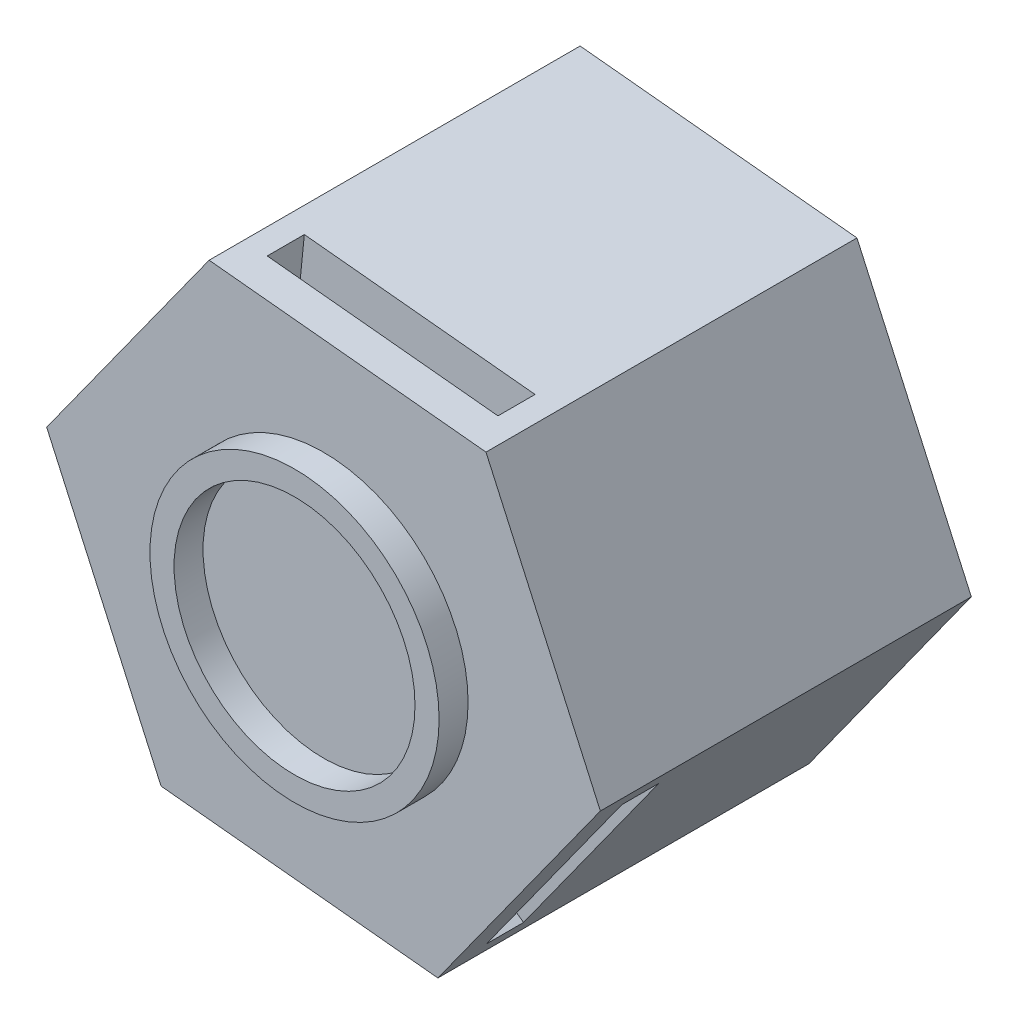
ISO-10303-21;
HEADER;
FILE_DESCRIPTION(('STEP AP214'),'2;1');
FILE_NAME('part.step','',(''),(''),'','','');
FILE_SCHEMA(('AUTOMOTIVE_DESIGN { 1 0 10303 214 1 1 1 1 }'));
ENDSEC;
DATA;
#1=APPLICATION_CONTEXT('core data for automotive mechanical design processes');
#2=APPLICATION_PROTOCOL_DEFINITION('international standard','automotive_design',2000,#1);
#3=PRODUCT_CONTEXT('',#1,'mechanical');
#4=PRODUCT('Part','Part','',(#3));
#5=PRODUCT_RELATED_PRODUCT_CATEGORY('part','',(#4));
#6=PRODUCT_DEFINITION_FORMATION('','',#4);
#7=PRODUCT_DEFINITION_CONTEXT('part definition',#1,'design');
#8=PRODUCT_DEFINITION('design','',#6,#7);
#9=PRODUCT_DEFINITION_SHAPE('','',#8);
#10=(LENGTH_UNIT() NAMED_UNIT(*) SI_UNIT(.MILLI.,.METRE.));
#11=(NAMED_UNIT(*) PLANE_ANGLE_UNIT() SI_UNIT($,.RADIAN.));
#12=(NAMED_UNIT(*) SI_UNIT($,.STERADIAN.) SOLID_ANGLE_UNIT());
#13=UNCERTAINTY_MEASURE_WITH_UNIT(LENGTH_MEASURE(1.E-05),#10,'distance_accuracy_value','');
#14=(GEOMETRIC_REPRESENTATION_CONTEXT(3) GLOBAL_UNCERTAINTY_ASSIGNED_CONTEXT((#13)) GLOBAL_UNIT_ASSIGNED_CONTEXT((#10,
#11,#12)) REPRESENTATION_CONTEXT('',''));
#15=CARTESIAN_POINT('',(0.,0.,0.));
#16=DIRECTION('',(0.,0.,1.));
#17=DIRECTION('',(1.,0.,0.));
#18=AXIS2_PLACEMENT_3D('',#15,#16,#17);
#19=CARTESIAN_POINT('',(-18.9475747095238,-8.54338414371113,2.));
#20=DIRECTION('',(0.911615613252842,0.4110437612635,0.));
#21=DIRECTION('',(-0.4110437612635,0.911615613252842,0.));
#22=AXIS2_PLACEMENT_3D('',#19,#20,#21);
#23=PLANE('',#22);
#24=DIRECTION('',(0.,0.,1.));
#25=VECTOR('',#24,1.);
#26=CARTESIAN_POINT('',(-14.8371370968889,-17.6595402762395,-1.02208910930593));
#27=LINE('',#26,#25);
#28=CARTESIAN_POINT('',(-14.8371370968888,-17.6595402762395,-4.22208910930593));
#29=VERTEX_POINT('',#28);
#30=CARTESIAN_POINT('',(-14.8371370968889,-17.6595402762395,-1.02208910930593));
#31=VERTEX_POINT('',#30);
#32=EDGE_CURVE('E201',#29,#31,#27,.T.);
#33=ORIENTED_EDGE('',*,*,#32,.F.);
#34=DIRECTION('',(0.411043761263495,-0.911615613252844,0.));
#35=VECTOR('',#34,1.);
#36=CARTESIAN_POINT('',(-14.8371370968889,-17.6595402762395,-4.22208910930593));
#37=LINE('',#36,#35);
#38=CARTESIAN_POINT('',(-23.0580123221588,0.57277198881742,-4.22208910930594));
#39=VERTEX_POINT('',#38);
#40=EDGE_CURVE('E59',#39,#29,#37,.T.);
#41=ORIENTED_EDGE('',*,*,#40,.F.);
#42=DIRECTION('',(0.,0.,-1.));
#43=VECTOR('',#42,1.);
#44=CARTESIAN_POINT('',(-23.0580123221588,0.57277198881742,-1.02208910930594));
#45=LINE('',#44,#43);
#46=CARTESIAN_POINT('',(-23.0580123221588,0.57277198881742,-1.02208910930594));
#47=VERTEX_POINT('',#46);
#48=EDGE_CURVE('E189',#47,#39,#45,.T.);
#49=ORIENTED_EDGE('',*,*,#48,.F.);
#50=DIRECTION('',(-0.411043761263495,0.911615613252844,0.));
#51=VECTOR('',#50,1.);
#52=CARTESIAN_POINT('',(-14.8371370968889,-17.6595402762395,-1.02208910930593));
#53=LINE('',#52,#51);
#54=EDGE_CURVE('E192',#31,#47,#53,.T.);
#55=ORIENTED_EDGE('',*,*,#54,.F.);
#56=EDGE_LOOP('',(#33,#41,#49,#55));
#57=FACE_BOUND('',#56,.T.);
#58=DIRECTION('',(0.,0.,-1.));
#59=VECTOR('',#58,1.);
#60=CARTESIAN_POINT('',(-23.8800998446858,2.39600321532298,2.));
#61=LINE('',#60,#59);
#62=CARTESIAN_POINT('',(-23.8800998446858,2.39600321532298,2.));
#63=VERTEX_POINT('',#62);
#64=CARTESIAN_POINT('',(-23.8800998446858,2.39600321532298,-30.));
#65=VERTEX_POINT('',#64);
#66=EDGE_CURVE('E312',#63,#65,#61,.T.);
#67=ORIENTED_EDGE('',*,*,#66,.T.);
#68=DIRECTION('',(0.4110437612635,-0.911615613252842,0.));
#69=VECTOR('',#68,1.);
#70=CARTESIAN_POINT('',(-18.9475747095238,-8.54338414371113,-30.));
#71=LINE('',#70,#69);
#72=CARTESIAN_POINT('',(-14.0150495743618,-19.4827715027452,-30.));
#73=VERTEX_POINT('',#72);
#74=EDGE_CURVE('E278',#65,#73,#71,.T.);
#75=ORIENTED_EDGE('',*,*,#74,.T.);
#76=DIRECTION('',(0.,0.,-1.));
#77=VECTOR('',#76,1.);
#78=CARTESIAN_POINT('',(-14.0150495743618,-19.4827715027452,2.));
#79=LINE('',#78,#77);
#80=CARTESIAN_POINT('',(-14.0150495743618,-19.4827715027452,2.));
#81=VERTEX_POINT('',#80);
#82=EDGE_CURVE('E52',#81,#73,#79,.T.);
#83=ORIENTED_EDGE('',*,*,#82,.F.);
#84=DIRECTION('',(0.4110437612635,-0.911615613252842,0.));
#85=VECTOR('',#84,1.);
#86=CARTESIAN_POINT('',(-18.9475747095238,-8.54338414371113,2.));
#87=LINE('',#86,#85);
#88=EDGE_CURVE('E299',#63,#81,#87,.T.);
#89=ORIENTED_EDGE('',*,*,#88,.F.);
#90=EDGE_LOOP('',(#67,#75,#83,#89));
#91=FACE_BOUND('',#90,.T.);
#92=ADVANCED_FACE('F45',(#57,#91),#23,.F.);
#93=CARTESIAN_POINT('',(-2.07499965201891,-20.6807731104067,2.));
#94=DIRECTION('',(0.0998334673051246,0.995004160195241,0.));
#95=DIRECTION('',(-0.995004160195241,0.0998334673051247,0.));
#96=AXIS2_PLACEMENT_3D('',#93,#94,#95);
#97=PLANE('',#96);
#98=ORIENTED_EDGE('',*,*,#82,.T.);
#99=DIRECTION('',(0.995004160195241,-0.0998334673051247,0.));
#100=VECTOR('',#99,1.);
#101=CARTESIAN_POINT('',(-2.07499965201891,-20.6807731104067,-30.));
#102=LINE('',#101,#100);
#103=CARTESIAN_POINT('',(9.86505027032396,-21.8787747180682,-30.));
#104=VERTEX_POINT('',#103);
#105=EDGE_CURVE('E281',#73,#104,#102,.T.);
#106=ORIENTED_EDGE('',*,*,#105,.T.);
#107=DIRECTION('',(0.,0.,-1.));
#108=VECTOR('',#107,1.);
#109=CARTESIAN_POINT('',(9.86505027032396,-21.8787747180682,2.));
#110=LINE('',#109,#108);
#111=CARTESIAN_POINT('',(9.86505027032396,-21.8787747180682,2.));
#112=VERTEX_POINT('',#111);
#113=EDGE_CURVE('E320',#112,#104,#110,.T.);
#114=ORIENTED_EDGE('',*,*,#113,.F.);
#115=DIRECTION('',(0.995004160195241,-0.0998334673051247,0.));
#116=VECTOR('',#115,1.);
#117=CARTESIAN_POINT('',(-2.07499965201891,-20.6807731104067,2.));
#118=LINE('',#117,#116);
#119=EDGE_CURVE('E302',#81,#112,#118,.T.);
#120=ORIENTED_EDGE('',*,*,#119,.F.);
#121=EDGE_LOOP('',(#98,#106,#114,#120));
#122=FACE_BOUND('',#121,.T.);
#123=ADVANCED_FACE('F324',(#122),#97,.F.);
#124=CARTESIAN_POINT('',(16.8725750575049,-12.1373889666956,2.));
#125=DIRECTION('',(-0.811782145947718,0.583960398931741,0.));
#126=DIRECTION('',(-0.583960398931741,-0.811782145947718,0.));
#127=AXIS2_PLACEMENT_3D('',#124,#125,#126);
#128=PLANE('',#127);
#129=DIRECTION('',(0.,0.,1.));
#130=VECTOR('',#129,1.);
#131=CARTESIAN_POINT('',(22.7121790468223,-4.01956750721841,-1.02208910930593));
#132=LINE('',#131,#130);
#133=CARTESIAN_POINT('',(22.7121790468223,-4.01956750721841,-4.22208910930593));
#134=VERTEX_POINT('',#133);
#135=CARTESIAN_POINT('',(22.7121790468223,-4.01956750721841,-1.02208910930593));
#136=VERTEX_POINT('',#135);
#137=EDGE_CURVE('E256',#134,#136,#132,.T.);
#138=ORIENTED_EDGE('',*,*,#137,.F.);
#139=DIRECTION('',(0.583960398931741,0.811782145947718,0.));
#140=VECTOR('',#139,1.);
#141=CARTESIAN_POINT('',(22.7121790468223,-4.01956750721841,-4.22208910930593));
#142=LINE('',#141,#140);
#143=CARTESIAN_POINT('',(11.0329710681875,-20.2552104261728,-4.22208910930594));
#144=VERTEX_POINT('',#143);
#145=EDGE_CURVE('E208',#144,#134,#142,.T.);
#146=ORIENTED_EDGE('',*,*,#145,.F.);
#147=DIRECTION('',(0.,0.,-1.));
#148=VECTOR('',#147,1.);
#149=CARTESIAN_POINT('',(11.0329710681875,-20.2552104261728,-1.02208910930594));
#150=LINE('',#149,#148);
#151=CARTESIAN_POINT('',(11.0329710681875,-20.2552104261728,-1.02208910930594));
#152=VERTEX_POINT('',#151);
#153=EDGE_CURVE('E245',#152,#144,#150,.T.);
#154=ORIENTED_EDGE('',*,*,#153,.F.);
#155=DIRECTION('',(-0.583960398931741,-0.811782145947718,0.));
#156=VECTOR('',#155,1.);
#157=CARTESIAN_POINT('',(22.7121790468223,-4.01956750721841,-1.02208910930593));
#158=LINE('',#157,#156);
#159=EDGE_CURVE('E259',#136,#152,#158,.T.);
#160=ORIENTED_EDGE('',*,*,#159,.F.);
#161=EDGE_LOOP('',(#138,#146,#154,#160));
#162=FACE_BOUND('',#161,.T.);
#163=ORIENTED_EDGE('',*,*,#113,.T.);
#164=DIRECTION('',(0.583960398931742,0.811782145947718,0.));
#165=VECTOR('',#164,1.);
#166=CARTESIAN_POINT('',(16.8725750575049,-12.1373889666956,-30.));
#167=LINE('',#166,#165);
#168=CARTESIAN_POINT('',(23.8800998446858,-2.39600321532299,-30.));
#169=VERTEX_POINT('',#168);
#170=EDGE_CURVE('E284',#104,#169,#167,.T.);
#171=ORIENTED_EDGE('',*,*,#170,.T.);
#172=DIRECTION('',(0.,0.,-1.));
#173=VECTOR('',#172,1.);
#174=CARTESIAN_POINT('',(23.8800998446858,-2.39600321532299,2.));
#175=LINE('',#174,#173);
#176=CARTESIAN_POINT('',(23.8800998446858,-2.39600321532299,2.));
#177=VERTEX_POINT('',#176);
#178=EDGE_CURVE('E318',#177,#169,#175,.T.);
#179=ORIENTED_EDGE('',*,*,#178,.F.);
#180=DIRECTION('',(0.583960398931742,0.811782145947718,0.));
#181=VECTOR('',#180,1.);
#182=CARTESIAN_POINT('',(16.8725750575049,-12.1373889666956,2.));
#183=LINE('',#182,#181);
#184=EDGE_CURVE('E304',#112,#177,#183,.T.);
#185=ORIENTED_EDGE('',*,*,#184,.F.);
#186=EDGE_LOOP('',(#163,#171,#179,#185));
#187=FACE_BOUND('',#186,.T.);
#188=ADVANCED_FACE('F349',(#162,#187),#128,.F.);
#189=CARTESIAN_POINT('',(18.9475747095238,8.5433841437111,2.));
#190=DIRECTION('',(-0.911615613252842,-0.411043761263499,0.));
#191=DIRECTION('',(0.411043761263499,-0.911615613252842,0.));
#192=AXIS2_PLACEMENT_3D('',#189,#190,#191);
#193=PLANE('',#192);
#194=ORIENTED_EDGE('',*,*,#178,.T.);
#195=DIRECTION('',(-0.411043761263499,0.911615613252842,0.));
#196=VECTOR('',#195,1.);
#197=CARTESIAN_POINT('',(18.9475747095238,8.5433841437111,-30.));
#198=LINE('',#197,#196);
#199=CARTESIAN_POINT('',(14.0150495743618,19.4827715027452,-30.));
#200=VERTEX_POINT('',#199);
#201=EDGE_CURVE('E287',#169,#200,#198,.T.);
#202=ORIENTED_EDGE('',*,*,#201,.T.);
#203=DIRECTION('',(0.,0.,-1.));
#204=VECTOR('',#203,1.);
#205=CARTESIAN_POINT('',(14.0150495743618,19.4827715027452,2.));
#206=LINE('',#205,#204);
#207=CARTESIAN_POINT('',(14.0150495743618,19.4827715027452,2.));
#208=VERTEX_POINT('',#207);
#209=EDGE_CURVE('E316',#208,#200,#206,.T.);
#210=ORIENTED_EDGE('',*,*,#209,.F.);
#211=DIRECTION('',(-0.411043761263499,0.911615613252842,0.));
#212=VECTOR('',#211,1.);
#213=CARTESIAN_POINT('',(18.9475747095238,8.5433841437111,2.));
#214=LINE('',#213,#212);
#215=EDGE_CURVE('E306',#177,#208,#214,.T.);
#216=ORIENTED_EDGE('',*,*,#215,.F.);
#217=EDGE_LOOP('',(#194,#202,#210,#216));
#218=FACE_BOUND('',#217,.T.);
#219=ADVANCED_FACE('F343',(#218),#193,.F.);
#220=CARTESIAN_POINT('',(2.07499965201891,20.6807731104067,2.));
#221=DIRECTION('',(-0.0998334673051247,-0.995004160195241,0.));
#222=DIRECTION('',(0.995004160195241,-0.0998334673051247,0.));
#223=AXIS2_PLACEMENT_3D('',#220,#221,#222);
#224=PLANE('',#223);
#225=DIRECTION('',(0.,0.,1.));
#226=VECTOR('',#225,1.);
#227=CARTESIAN_POINT('',(-7.87504194993331,21.679107783458,-1.02208910930593));
#228=LINE('',#227,#226);
#229=CARTESIAN_POINT('',(-7.87504194993331,21.679107783458,-4.22208910930593));
#230=VERTEX_POINT('',#229);
#231=CARTESIAN_POINT('',(-7.87504194993331,21.679107783458,-1.02208910930593));
#232=VERTEX_POINT('',#231);
#233=EDGE_CURVE('E227',#230,#232,#228,.T.);
#234=ORIENTED_EDGE('',*,*,#233,.F.);
#235=DIRECTION('',(-0.99500416019524,0.0998334673051337,0.));
#236=VECTOR('',#235,1.);
#237=CARTESIAN_POINT('',(-7.87504194993331,21.679107783458,-4.22208910930593));
#238=LINE('',#237,#236);
#239=CARTESIAN_POINT('',(12.0250412539715,19.6824384373553,-4.22208910930594));
#240=VERTEX_POINT('',#239);
#241=EDGE_CURVE('E67',#240,#230,#238,.T.);
#242=ORIENTED_EDGE('',*,*,#241,.F.);
#243=DIRECTION('',(0.,0.,-1.));
#244=VECTOR('',#243,1.);
#245=CARTESIAN_POINT('',(12.0250412539715,19.6824384373553,-1.02208910930594));
#246=LINE('',#245,#244);
#247=CARTESIAN_POINT('',(12.0250412539715,19.6824384373553,-1.02208910930594));
#248=VERTEX_POINT('',#247);
#249=EDGE_CURVE('E216',#248,#240,#246,.T.);
#250=ORIENTED_EDGE('',*,*,#249,.F.);
#251=DIRECTION('',(0.99500416019524,-0.0998334673051337,0.));
#252=VECTOR('',#251,1.);
#253=CARTESIAN_POINT('',(-7.87504194993331,21.679107783458,-1.02208910930593));
#254=LINE('',#253,#252);
#255=EDGE_CURVE('E230',#232,#248,#254,.T.);
#256=ORIENTED_EDGE('',*,*,#255,.F.);
#257=EDGE_LOOP('',(#234,#242,#250,#256));
#258=FACE_BOUND('',#257,.T.);
#259=ORIENTED_EDGE('',*,*,#209,.T.);
#260=DIRECTION('',(-0.995004160195241,0.0998334673051247,0.));
#261=VECTOR('',#260,1.);
#262=CARTESIAN_POINT('',(2.07499965201891,20.6807731104067,-30.));
#263=LINE('',#262,#261);
#264=CARTESIAN_POINT('',(-9.86505027032398,21.8787747180682,-30.));
#265=VERTEX_POINT('',#264);
#266=EDGE_CURVE('E290',#200,#265,#263,.T.);
#267=ORIENTED_EDGE('',*,*,#266,.T.);
#268=DIRECTION('',(0.,0.,-1.));
#269=VECTOR('',#268,1.);
#270=CARTESIAN_POINT('',(-9.86505027032398,21.8787747180682,2.));
#271=LINE('',#270,#269);
#272=CARTESIAN_POINT('',(-9.86505027032398,21.8787747180682,2.));
#273=VERTEX_POINT('',#272);
#274=EDGE_CURVE('E314',#273,#265,#271,.T.);
#275=ORIENTED_EDGE('',*,*,#274,.F.);
#276=DIRECTION('',(-0.995004160195241,0.0998334673051247,0.));
#277=VECTOR('',#276,1.);
#278=CARTESIAN_POINT('',(2.07499965201891,20.6807731104067,2.));
#279=LINE('',#278,#277);
#280=EDGE_CURVE('E308',#208,#273,#279,.T.);
#281=ORIENTED_EDGE('',*,*,#280,.F.);
#282=EDGE_LOOP('',(#259,#267,#275,#281));
#283=FACE_BOUND('',#282,.T.);
#284=ADVANCED_FACE('F352',(#258,#283),#224,.F.);
#285=CARTESIAN_POINT('',(-16.8725750575049,12.1373889666956,2.));
#286=DIRECTION('',(0.811782145947718,-0.583960398931741,0.));
#287=DIRECTION('',(0.583960398931741,0.811782145947718,0.));
#288=AXIS2_PLACEMENT_3D('',#285,#286,#287);
#289=PLANE('',#288);
#290=ORIENTED_EDGE('',*,*,#274,.T.);
#291=DIRECTION('',(-0.583960398931742,-0.811782145947718,0.));
#292=VECTOR('',#291,1.);
#293=CARTESIAN_POINT('',(-16.8725750575049,12.1373889666956,-30.));
#294=LINE('',#293,#292);
#295=EDGE_CURVE('E293',#265,#65,#294,.T.);
#296=ORIENTED_EDGE('',*,*,#295,.T.);
#297=ORIENTED_EDGE('',*,*,#66,.F.);
#298=DIRECTION('',(-0.583960398931742,-0.811782145947718,0.));
#299=VECTOR('',#298,1.);
#300=CARTESIAN_POINT('',(-16.8725750575049,12.1373889666956,2.));
#301=LINE('',#300,#299);
#302=EDGE_CURVE('E310',#273,#63,#301,.T.);
#303=ORIENTED_EDGE('',*,*,#302,.F.);
#304=EDGE_LOOP('',(#290,#296,#297,#303));
#305=FACE_BOUND('',#304,.T.);
#306=ADVANCED_FACE('F337',(#305),#289,.F.);
#307=CARTESIAN_POINT('',(0.,0.,2.));
#308=DIRECTION('',(0.,0.,1.));
#309=DIRECTION('',(1.,0.,0.));
#310=AXIS2_PLACEMENT_3D('',#307,#308,#309);
#311=PLANE('',#310);
#312=CARTESIAN_POINT('',(0.,0.,2.));
#313=DIRECTION('',(0.,0.,1.));
#314=DIRECTION('',(1.,0.,0.));
#315=AXIS2_PLACEMENT_3D('',#312,#313,#314);
#316=CIRCLE('',#315,12.4707658144959);
#317=CARTESIAN_POINT('',(12.4707658144959,0.,2.));
#318=VERTEX_POINT('',#317);
#319=EDGE_CURVE('E296',#318,#318,#316,.T.);
#320=ORIENTED_EDGE('',*,*,#319,.F.);
#321=EDGE_LOOP('',(#320));
#322=FACE_BOUND('',#321,.T.);
#323=ORIENTED_EDGE('',*,*,#88,.T.);
#324=ORIENTED_EDGE('',*,*,#119,.T.);
#325=ORIENTED_EDGE('',*,*,#184,.T.);
#326=ORIENTED_EDGE('',*,*,#215,.T.);
#327=ORIENTED_EDGE('',*,*,#280,.T.);
#328=ORIENTED_EDGE('',*,*,#302,.T.);
#329=EDGE_LOOP('',(#323,#324,#325,#326,#327,#328));
#330=FACE_BOUND('',#329,.T.);
#331=ADVANCED_FACE('F351',(#322,#330),#311,.T.);
#332=CARTESIAN_POINT('',(0.,0.,-30.));
#333=DIRECTION('',(0.,0.,1.));
#334=DIRECTION('',(1.,0.,0.));
#335=AXIS2_PLACEMENT_3D('',#332,#333,#334);
#336=PLANE('',#335);
#337=CARTESIAN_POINT('',(0.,0.,-30.));
#338=DIRECTION('',(0.,0.,-1.));
#339=DIRECTION('',(-1.,0.,0.));
#340=AXIS2_PLACEMENT_3D('',#337,#338,#339);
#341=CIRCLE('',#340,4.);
#342=CARTESIAN_POINT('',(-4.,0.,-30.));
#343=VERTEX_POINT('',#342);
#344=EDGE_CURVE('E195',#343,#343,#341,.T.);
#345=ORIENTED_EDGE('',*,*,#344,.F.);
#346=EDGE_LOOP('',(#345));
#347=FACE_BOUND('',#346,.T.);
#348=ORIENTED_EDGE('',*,*,#74,.F.);
#349=ORIENTED_EDGE('',*,*,#295,.F.);
#350=ORIENTED_EDGE('',*,*,#266,.F.);
#351=ORIENTED_EDGE('',*,*,#201,.F.);
#352=ORIENTED_EDGE('',*,*,#170,.F.);
#353=ORIENTED_EDGE('',*,*,#105,.F.);
#354=EDGE_LOOP('',(#348,#349,#350,#351,#352,#353));
#355=FACE_BOUND('',#354,.T.);
#356=ADVANCED_FACE('F331',(#347,#355),#336,.F.);
#357=CARTESIAN_POINT('',(0.,0.,4.5));
#358=DIRECTION('',(0.,0.,-1.));
#359=DIRECTION('',(-1.,0.,0.));
#360=AXIS2_PLACEMENT_3D('',#357,#358,#359);
#361=CYLINDRICAL_SURFACE('',#360,10.3923048454133);
#362=CARTESIAN_POINT('',(0.,0.,2.));
#363=DIRECTION('',(0.,0.,1.));
#364=DIRECTION('',(1.,0.,0.));
#365=AXIS2_PLACEMENT_3D('',#362,#363,#364);
#366=CIRCLE('',#365,10.3923048454133);
#367=CARTESIAN_POINT('',(10.3923048454133,0.,2.));
#368=VERTEX_POINT('',#367);
#369=EDGE_CURVE('E12',#368,#368,#366,.T.);
#370=ORIENTED_EDGE('',*,*,#369,.F.);
#371=EDGE_LOOP('',(#370));
#372=FACE_BOUND('',#371,.T.);
#373=CARTESIAN_POINT('',(0.,0.,4.5));
#374=DIRECTION('',(0.,0.,1.));
#375=DIRECTION('',(1.,0.,0.));
#376=AXIS2_PLACEMENT_3D('',#373,#374,#375);
#377=CIRCLE('',#376,10.3923048454133);
#378=CARTESIAN_POINT('',(10.3923048454133,0.,4.5));
#379=VERTEX_POINT('',#378);
#380=EDGE_CURVE('E266',#379,#379,#377,.T.);
#381=ORIENTED_EDGE('',*,*,#380,.T.);
#382=EDGE_LOOP('',(#381));
#383=FACE_BOUND('',#382,.T.);
#384=ADVANCED_FACE('F437',(#372,#383),#361,.F.);
#385=CARTESIAN_POINT('',(0.,0.,4.5));
#386=DIRECTION('',(0.,0.,-1.));
#387=DIRECTION('',(-1.,0.,0.));
#388=AXIS2_PLACEMENT_3D('',#385,#386,#387);
#389=CYLINDRICAL_SURFACE('',#388,12.4707658144959);
#390=ORIENTED_EDGE('',*,*,#319,.T.);
#391=EDGE_LOOP('',(#390));
#392=FACE_BOUND('',#391,.T.);
#393=CARTESIAN_POINT('',(0.,0.,4.5));
#394=DIRECTION('',(0.,0.,1.));
#395=DIRECTION('',(1.,0.,0.));
#396=AXIS2_PLACEMENT_3D('',#393,#394,#395);
#397=CIRCLE('',#396,12.4707658144959);
#398=CARTESIAN_POINT('',(12.4707658144959,0.,4.5));
#399=VERTEX_POINT('',#398);
#400=EDGE_CURVE('E275',#399,#399,#397,.T.);
#401=ORIENTED_EDGE('',*,*,#400,.F.);
#402=EDGE_LOOP('',(#401));
#403=FACE_BOUND('',#402,.T.);
#404=ADVANCED_FACE('F433',(#392,#403),#389,.T.);
#405=CARTESIAN_POINT('',(0.,0.,4.5));
#406=DIRECTION('',(0.,0.,1.));
#407=DIRECTION('',(1.,0.,0.));
#408=AXIS2_PLACEMENT_3D('',#405,#406,#407);
#409=PLANE('',#408);
#410=ORIENTED_EDGE('',*,*,#380,.F.);
#411=EDGE_LOOP('',(#410));
#412=FACE_BOUND('',#411,.T.);
#413=ORIENTED_EDGE('',*,*,#400,.T.);
#414=EDGE_LOOP('',(#413));
#415=FACE_BOUND('',#414,.T.);
#416=ADVANCED_FACE('F429',(#412,#415),#409,.T.);
#417=CARTESIAN_POINT('',(0.,0.,2.));
#418=DIRECTION('',(0.,0.,1.));
#419=DIRECTION('',(1.,0.,0.));
#420=AXIS2_PLACEMENT_3D('',#417,#418,#419);
#421=PLANE('',#420);
#422=ORIENTED_EDGE('',*,*,#369,.T.);
#423=EDGE_LOOP('',(#422));
#424=FACE_BOUND('',#423,.T.);
#425=ADVANCED_FACE('F425',(#424),#421,.T.);
#426=CARTESIAN_POINT('',(18.6532683170837,-1.0997655125597,-4.22208910930593));
#427=DIRECTION('',(0.,0.,-1.));
#428=DIRECTION('',(0.,1.,0.));
#429=AXIS2_PLACEMENT_3D('',#426,#427,#428);
#430=PLANE('',#429);
#431=ORIENTED_EDGE('',*,*,#145,.T.);
#432=DIRECTION('',(0.811782145947718,-0.583960398931741,0.));
#433=VECTOR('',#432,1.);
#434=CARTESIAN_POINT('',(18.6532683170837,-1.0997655125597,-4.22208910930593));
#435=LINE('',#434,#433);
#436=CARTESIAN_POINT('',(18.6532683170837,-1.0997655125597,-4.22208910930593));
#437=VERTEX_POINT('',#436);
#438=EDGE_CURVE('E254',#437,#134,#435,.T.);
#439=ORIENTED_EDGE('',*,*,#438,.F.);
#440=DIRECTION('',(0.583960398931741,0.811782145947718,0.));
#441=VECTOR('',#440,1.);
#442=CARTESIAN_POINT('',(18.6532683170837,-1.0997655125597,-4.22208910930593));
#443=LINE('',#442,#441);
#444=CARTESIAN_POINT('',(6.97406033844886,-17.3354084315141,-4.22208910930594));
#445=VERTEX_POINT('',#444);
#446=EDGE_CURVE('E241',#445,#437,#443,.T.);
#447=ORIENTED_EDGE('',*,*,#446,.F.);
#448=DIRECTION('',(0.811782145947718,-0.583960398931741,0.));
#449=VECTOR('',#448,1.);
#450=CARTESIAN_POINT('',(6.97406033844886,-17.3354084315141,-4.22208910930594));
#451=LINE('',#450,#449);
#452=EDGE_CURVE('E264',#445,#144,#451,.T.);
#453=ORIENTED_EDGE('',*,*,#452,.T.);
#454=EDGE_LOOP('',(#431,#439,#447,#453));
#455=FACE_BOUND('',#454,.T.);
#456=ADVANCED_FACE('F415',(#455),#430,.F.);
#457=CARTESIAN_POINT('',(6.97406033844886,-17.3354084315141,-1.02208910930594));
#458=DIRECTION('',(-0.583960398931741,-0.811782145947718,0.));
#459=DIRECTION('',(0.811782145947718,-0.583960398931741,0.));
#460=AXIS2_PLACEMENT_3D('',#457,#458,#459);
#461=PLANE('',#460);
#462=ORIENTED_EDGE('',*,*,#153,.T.);
#463=ORIENTED_EDGE('',*,*,#452,.F.);
#464=DIRECTION('',(0.,0.,-1.));
#465=VECTOR('',#464,1.);
#466=CARTESIAN_POINT('',(6.97406033844886,-17.3354084315141,-1.02208910930594));
#467=LINE('',#466,#465);
#468=CARTESIAN_POINT('',(6.97406033844886,-17.3354084315141,-1.02208910930594));
#469=VERTEX_POINT('',#468);
#470=EDGE_CURVE('E251',#469,#445,#467,.T.);
#471=ORIENTED_EDGE('',*,*,#470,.F.);
#472=DIRECTION('',(0.811782145947718,-0.583960398931741,0.));
#473=VECTOR('',#472,1.);
#474=CARTESIAN_POINT('',(6.97406033844886,-17.3354084315141,-1.02208910930594));
#475=LINE('',#474,#473);
#476=EDGE_CURVE('E267',#469,#152,#475,.T.);
#477=ORIENTED_EDGE('',*,*,#476,.T.);
#478=EDGE_LOOP('',(#462,#463,#471,#477));
#479=FACE_BOUND('',#478,.T.);
#480=ADVANCED_FACE('F411',(#479),#461,.F.);
#481=CARTESIAN_POINT('',(18.6532683170837,-1.0997655125597,-1.02208910930593));
#482=DIRECTION('',(0.,0.,1.));
#483=DIRECTION('',(0.,-1.,0.));
#484=AXIS2_PLACEMENT_3D('',#481,#482,#483);
#485=PLANE('',#484);
#486=ORIENTED_EDGE('',*,*,#159,.T.);
#487=ORIENTED_EDGE('',*,*,#476,.F.);
#488=DIRECTION('',(-0.583960398931741,-0.811782145947718,0.));
#489=VECTOR('',#488,1.);
#490=CARTESIAN_POINT('',(18.6532683170837,-1.0997655125597,-1.02208910930593));
#491=LINE('',#490,#489);
#492=CARTESIAN_POINT('',(18.6532683170837,-1.0997655125597,-1.02208910930593));
#493=VERTEX_POINT('',#492);
#494=EDGE_CURVE('E248',#493,#469,#491,.T.);
#495=ORIENTED_EDGE('',*,*,#494,.F.);
#496=DIRECTION('',(0.811782145947718,-0.583960398931741,0.));
#497=VECTOR('',#496,1.);
#498=CARTESIAN_POINT('',(18.6532683170837,-1.0997655125597,-1.02208910930593));
#499=LINE('',#498,#497);
#500=EDGE_CURVE('E269',#493,#136,#499,.T.);
#501=ORIENTED_EDGE('',*,*,#500,.T.);
#502=EDGE_LOOP('',(#486,#487,#495,#501));
#503=FACE_BOUND('',#502,.T.);
#504=ADVANCED_FACE('F414',(#503),#485,.F.);
#505=CARTESIAN_POINT('',(18.6532683170837,-1.0997655125597,-1.02208910930593));
#506=DIRECTION('',(0.583960398931741,0.811782145947718,0.));
#507=DIRECTION('',(-0.811782145947718,0.583960398931741,0.));
#508=AXIS2_PLACEMENT_3D('',#505,#506,#507);
#509=PLANE('',#508);
#510=ORIENTED_EDGE('',*,*,#137,.T.);
#511=ORIENTED_EDGE('',*,*,#500,.F.);
#512=DIRECTION('',(0.,0.,1.));
#513=VECTOR('',#512,1.);
#514=CARTESIAN_POINT('',(18.6532683170837,-1.0997655125597,-1.02208910930593));
#515=LINE('',#514,#513);
#516=EDGE_CURVE('E244',#437,#493,#515,.T.);
#517=ORIENTED_EDGE('',*,*,#516,.F.);
#518=ORIENTED_EDGE('',*,*,#438,.T.);
#519=EDGE_LOOP('',(#510,#511,#517,#518));
#520=FACE_BOUND('',#519,.T.);
#521=ADVANCED_FACE('F409',(#520),#509,.F.);
#522=CARTESIAN_POINT('',(12.8136643277663,-9.21758697203688,0.));
#523=DIRECTION('',(0.811782145947718,-0.583960398931741,0.));
#524=DIRECTION('',(0.583960398931741,0.811782145947718,0.));
#525=AXIS2_PLACEMENT_3D('',#522,#523,#524);
#526=PLANE('',#525);
#527=ORIENTED_EDGE('',*,*,#446,.T.);
#528=ORIENTED_EDGE('',*,*,#516,.T.);
#529=ORIENTED_EDGE('',*,*,#494,.T.);
#530=ORIENTED_EDGE('',*,*,#470,.T.);
#531=EDGE_LOOP('',(#527,#528,#529,#530));
#532=FACE_BOUND('',#531,.T.);
#533=ADVANCED_FACE('F406',(#532),#526,.T.);
#534=CARTESIAN_POINT('',(-8.37420928645897,16.7040869824818,-4.22208910930593));
#535=DIRECTION('',(0.,0.,-1.));
#536=DIRECTION('',(-1.,0.,0.));
#537=AXIS2_PLACEMENT_3D('',#534,#535,#536);
#538=PLANE('',#537);
#539=ORIENTED_EDGE('',*,*,#241,.T.);
#540=DIRECTION('',(0.0998334673051338,0.99500416019524,0.));
#541=VECTOR('',#540,1.);
#542=CARTESIAN_POINT('',(-8.37420928645897,16.7040869824818,-4.22208910930593));
#543=LINE('',#542,#541);
#544=CARTESIAN_POINT('',(-8.37420928645897,16.7040869824818,-4.22208910930593));
#545=VERTEX_POINT('',#544);
#546=EDGE_CURVE('E225',#545,#230,#543,.T.);
#547=ORIENTED_EDGE('',*,*,#546,.F.);
#548=DIRECTION('',(-0.99500416019524,0.0998334673051337,0.));
#549=VECTOR('',#548,1.);
#550=CARTESIAN_POINT('',(-8.37420928645897,16.7040869824818,-4.22208910930593));
#551=LINE('',#550,#549);
#552=CARTESIAN_POINT('',(11.5258739174458,14.7074176363791,-4.22208910930594));
#553=VERTEX_POINT('',#552);
#554=EDGE_CURVE('E212',#553,#545,#551,.T.);
#555=ORIENTED_EDGE('',*,*,#554,.F.);
#556=DIRECTION('',(0.0998334673051338,0.99500416019524,0.));
#557=VECTOR('',#556,1.);
#558=CARTESIAN_POINT('',(11.5258739174458,14.7074176363791,-4.22208910930594));
#559=LINE('',#558,#557);
#560=EDGE_CURVE('E202',#553,#240,#559,.T.);
#561=ORIENTED_EDGE('',*,*,#560,.T.);
#562=EDGE_LOOP('',(#539,#547,#555,#561));
#563=FACE_BOUND('',#562,.T.);
#564=ADVANCED_FACE('F396',(#563),#538,.F.);
#565=CARTESIAN_POINT('',(11.5258739174458,14.7074176363791,-1.02208910930594));
#566=DIRECTION('',(0.99500416019524,-0.0998334673051338,0.));
#567=DIRECTION('',(0.0998334673051338,0.99500416019524,0.));
#568=AXIS2_PLACEMENT_3D('',#565,#566,#567);
#569=PLANE('',#568);
#570=ORIENTED_EDGE('',*,*,#249,.T.);
#571=ORIENTED_EDGE('',*,*,#560,.F.);
#572=DIRECTION('',(0.,0.,-1.));
#573=VECTOR('',#572,1.);
#574=CARTESIAN_POINT('',(11.5258739174458,14.7074176363791,-1.02208910930594));
#575=LINE('',#574,#573);
#576=CARTESIAN_POINT('',(11.5258739174458,14.7074176363791,-1.02208910930594));
#577=VERTEX_POINT('',#576);
#578=EDGE_CURVE('E222',#577,#553,#575,.T.);
#579=ORIENTED_EDGE('',*,*,#578,.F.);
#580=DIRECTION('',(0.0998334673051338,0.99500416019524,0.));
#581=VECTOR('',#580,1.);
#582=CARTESIAN_POINT('',(11.5258739174458,14.7074176363791,-1.02208910930594));
#583=LINE('',#582,#581);
#584=EDGE_CURVE('E236',#577,#248,#583,.T.);
#585=ORIENTED_EDGE('',*,*,#584,.T.);
#586=EDGE_LOOP('',(#570,#571,#579,#585));
#587=FACE_BOUND('',#586,.T.);
#588=ADVANCED_FACE('F392',(#587),#569,.F.);
#589=CARTESIAN_POINT('',(-8.37420928645897,16.7040869824818,-1.02208910930593));
#590=DIRECTION('',(0.,0.,1.));
#591=DIRECTION('',(1.,0.,0.));
#592=AXIS2_PLACEMENT_3D('',#589,#590,#591);
#593=PLANE('',#592);
#594=ORIENTED_EDGE('',*,*,#255,.T.);
#595=ORIENTED_EDGE('',*,*,#584,.F.);
#596=DIRECTION('',(0.99500416019524,-0.0998334673051337,0.));
#597=VECTOR('',#596,1.);
#598=CARTESIAN_POINT('',(-8.37420928645897,16.7040869824818,-1.02208910930593));
#599=LINE('',#598,#597);
#600=CARTESIAN_POINT('',(-8.37420928645897,16.7040869824818,-1.02208910930593));
#601=VERTEX_POINT('',#600);
#602=EDGE_CURVE('E219',#601,#577,#599,.T.);
#603=ORIENTED_EDGE('',*,*,#602,.F.);
#604=DIRECTION('',(0.0998334673051338,0.99500416019524,0.));
#605=VECTOR('',#604,1.);
#606=CARTESIAN_POINT('',(-8.37420928645897,16.7040869824818,-1.02208910930593));
#607=LINE('',#606,#605);
#608=EDGE_CURVE('E238',#601,#232,#607,.T.);
#609=ORIENTED_EDGE('',*,*,#608,.T.);
#610=EDGE_LOOP('',(#594,#595,#603,#609));
#611=FACE_BOUND('',#610,.T.);
#612=ADVANCED_FACE('F395',(#611),#593,.F.);
#613=CARTESIAN_POINT('',(-8.37420928645897,16.7040869824818,-1.02208910930593));
#614=DIRECTION('',(-0.99500416019524,0.0998334673051338,0.));
#615=DIRECTION('',(-0.0998334673051338,-0.99500416019524,0.));
#616=AXIS2_PLACEMENT_3D('',#613,#614,#615);
#617=PLANE('',#616);
#618=ORIENTED_EDGE('',*,*,#233,.T.);
#619=ORIENTED_EDGE('',*,*,#608,.F.);
#620=DIRECTION('',(0.,0.,1.));
#621=VECTOR('',#620,1.);
#622=CARTESIAN_POINT('',(-8.37420928645897,16.7040869824818,-1.02208910930593));
#623=LINE('',#622,#621);
#624=EDGE_CURVE('E215',#545,#601,#623,.T.);
#625=ORIENTED_EDGE('',*,*,#624,.F.);
#626=ORIENTED_EDGE('',*,*,#546,.T.);
#627=EDGE_LOOP('',(#618,#619,#625,#626));
#628=FACE_BOUND('',#627,.T.);
#629=ADVANCED_FACE('F390',(#628),#617,.F.);
#630=CARTESIAN_POINT('',(1.57583231549342,15.7057523094305,0.));
#631=DIRECTION('',(0.0998334673051336,0.99500416019524,0.));
#632=DIRECTION('',(-0.99500416019524,0.0998334673051336,0.));
#633=AXIS2_PLACEMENT_3D('',#630,#631,#632);
#634=PLANE('',#633);
#635=ORIENTED_EDGE('',*,*,#554,.T.);
#636=ORIENTED_EDGE('',*,*,#624,.T.);
#637=ORIENTED_EDGE('',*,*,#602,.T.);
#638=ORIENTED_EDGE('',*,*,#578,.T.);
#639=EDGE_LOOP('',(#635,#636,#637,#638));
#640=FACE_BOUND('',#639,.T.);
#641=ADVANCED_FACE('F381',(#640),#634,.T.);
#642=CARTESIAN_POINT('',(-10.2790590306246,-15.604321469922,-4.22208910930593));
#643=DIRECTION('',(0.,0.,-1.));
#644=DIRECTION('',(0.,1.,0.));
#645=AXIS2_PLACEMENT_3D('',#642,#643,#644);
#646=PLANE('',#645);
#647=ORIENTED_EDGE('',*,*,#40,.T.);
#648=DIRECTION('',(-0.911615613252844,-0.411043761263495,0.));
#649=VECTOR('',#648,1.);
#650=CARTESIAN_POINT('',(-10.2790590306246,-15.604321469922,-4.22208910930593));
#651=LINE('',#650,#649);
#652=CARTESIAN_POINT('',(-10.2790590306246,-15.604321469922,-4.22208910930593));
#653=VERTEX_POINT('',#652);
#654=EDGE_CURVE('E167',#653,#29,#651,.T.);
#655=ORIENTED_EDGE('',*,*,#654,.F.);
#656=DIRECTION('',(0.411043761263495,-0.911615613252844,0.));
#657=VECTOR('',#656,1.);
#658=CARTESIAN_POINT('',(-10.2790590306246,-15.604321469922,-4.22208910930593));
#659=LINE('',#658,#657);
#660=CARTESIAN_POINT('',(-18.4999342558945,2.6279907951349,-4.22208910930594));
#661=VERTEX_POINT('',#660);
#662=EDGE_CURVE('E171',#661,#653,#659,.T.);
#663=ORIENTED_EDGE('',*,*,#662,.F.);
#664=DIRECTION('',(-0.911615613252844,-0.411043761263495,0.));
#665=VECTOR('',#664,1.);
#666=CARTESIAN_POINT('',(-18.4999342558945,2.6279907951349,-4.22208910930594));
#667=LINE('',#666,#665);
#668=EDGE_CURVE('E206',#661,#39,#667,.T.);
#669=ORIENTED_EDGE('',*,*,#668,.T.);
#670=EDGE_LOOP('',(#647,#655,#663,#669));
#671=FACE_BOUND('',#670,.T.);
#672=ADVANCED_FACE('F169',(#671),#646,.F.);
#673=CARTESIAN_POINT('',(-18.4999342558945,2.6279907951349,-1.02208910930594));
#674=DIRECTION('',(-0.411043761263495,0.911615613252844,0.));
#675=DIRECTION('',(-0.911615613252844,-0.411043761263495,0.));
#676=AXIS2_PLACEMENT_3D('',#673,#674,#675);
#677=PLANE('',#676);
#678=ORIENTED_EDGE('',*,*,#48,.T.);
#679=ORIENTED_EDGE('',*,*,#668,.F.);
#680=DIRECTION('',(0.,0.,-1.));
#681=VECTOR('',#680,1.);
#682=CARTESIAN_POINT('',(-18.4999342558945,2.6279907951349,-1.02208910930594));
#683=LINE('',#682,#681);
#684=CARTESIAN_POINT('',(-18.4999342558945,2.6279907951349,-1.02208910930594));
#685=VERTEX_POINT('',#684);
#686=EDGE_CURVE('E177',#685,#661,#683,.T.);
#687=ORIENTED_EDGE('',*,*,#686,.F.);
#688=DIRECTION('',(-0.911615613252844,-0.411043761263495,0.));
#689=VECTOR('',#688,1.);
#690=CARTESIAN_POINT('',(-18.4999342558945,2.6279907951349,-1.02208910930594));
#691=LINE('',#690,#689);
#692=EDGE_CURVE('E209',#685,#47,#691,.T.);
#693=ORIENTED_EDGE('',*,*,#692,.T.);
#694=EDGE_LOOP('',(#678,#679,#687,#693));
#695=FACE_BOUND('',#694,.T.);
#696=ADVANCED_FACE('F373',(#695),#677,.F.);
#697=CARTESIAN_POINT('',(-10.2790590306246,-15.604321469922,-1.02208910930593));
#698=DIRECTION('',(0.,0.,1.));
#699=DIRECTION('',(0.,-1.,0.));
#700=AXIS2_PLACEMENT_3D('',#697,#698,#699);
#701=PLANE('',#700);
#702=ORIENTED_EDGE('',*,*,#54,.T.);
#703=ORIENTED_EDGE('',*,*,#692,.F.);
#704=DIRECTION('',(-0.411043761263495,0.911615613252844,0.));
#705=VECTOR('',#704,1.);
#706=CARTESIAN_POINT('',(-10.2790590306246,-15.604321469922,-1.02208910930593));
#707=LINE('',#706,#705);
#708=CARTESIAN_POINT('',(-10.2790590306246,-15.604321469922,-1.02208910930593));
#709=VERTEX_POINT('',#708);
#710=EDGE_CURVE('E185',#709,#685,#707,.T.);
#711=ORIENTED_EDGE('',*,*,#710,.F.);
#712=DIRECTION('',(-0.911615613252844,-0.411043761263495,0.));
#713=VECTOR('',#712,1.);
#714=CARTESIAN_POINT('',(-10.2790590306246,-15.604321469922,-1.02208910930593));
#715=LINE('',#714,#713);
#716=EDGE_CURVE('E176',#709,#31,#715,.T.);
#717=ORIENTED_EDGE('',*,*,#716,.T.);
#718=EDGE_LOOP('',(#702,#703,#711,#717));
#719=FACE_BOUND('',#718,.T.);
#720=ADVANCED_FACE('F371',(#719),#701,.F.);
#721=CARTESIAN_POINT('',(-10.2790590306246,-15.604321469922,-1.02208910930593));
#722=DIRECTION('',(0.411043761263495,-0.911615613252844,0.));
#723=DIRECTION('',(0.911615613252844,0.411043761263495,0.));
#724=AXIS2_PLACEMENT_3D('',#721,#722,#723);
#725=PLANE('',#724);
#726=ORIENTED_EDGE('',*,*,#32,.T.);
#727=ORIENTED_EDGE('',*,*,#716,.F.);
#728=DIRECTION('',(0.,0.,1.));
#729=VECTOR('',#728,1.);
#730=CARTESIAN_POINT('',(-10.2790590306246,-15.604321469922,-1.02208910930593));
#731=LINE('',#730,#729);
#732=EDGE_CURVE('E180',#653,#709,#731,.T.);
#733=ORIENTED_EDGE('',*,*,#732,.F.);
#734=ORIENTED_EDGE('',*,*,#654,.T.);
#735=EDGE_LOOP('',(#726,#727,#733,#734));
#736=FACE_BOUND('',#735,.T.);
#737=ADVANCED_FACE('F181',(#736),#725,.F.);
#738=CARTESIAN_POINT('',(-14.3894966432596,-6.48816533739355,0.));
#739=DIRECTION('',(-0.911615613252844,-0.411043761263495,0.));
#740=DIRECTION('',(0.411043761263495,-0.911615613252844,0.));
#741=AXIS2_PLACEMENT_3D('',#738,#739,#740);
#742=PLANE('',#741);
#743=ORIENTED_EDGE('',*,*,#662,.T.);
#744=ORIENTED_EDGE('',*,*,#732,.T.);
#745=ORIENTED_EDGE('',*,*,#710,.T.);
#746=ORIENTED_EDGE('',*,*,#686,.T.);
#747=EDGE_LOOP('',(#743,#744,#745,#746));
#748=FACE_BOUND('',#747,.T.);
#749=ADVANCED_FACE('F187',(#748),#742,.T.);
#750=CARTESIAN_POINT('',(0.,0.,-41.));
#751=DIRECTION('',(0.,0.,-1.));
#752=DIRECTION('',(-1.,0.,0.));
#753=AXIS2_PLACEMENT_3D('',#750,#751,#752);
#754=PLANE('',#753);
#755=CARTESIAN_POINT('',(0.,0.,-41.));
#756=DIRECTION('',(0.,0.,-1.));
#757=DIRECTION('',(-1.,0.,0.));
#758=AXIS2_PLACEMENT_3D('',#755,#756,#757);
#759=CIRCLE('',#758,6.);
#760=CARTESIAN_POINT('',(-6.,0.,-41.));
#761=VERTEX_POINT('',#760);
#762=EDGE_CURVE('E718',#761,#761,#759,.T.);
#763=ORIENTED_EDGE('',*,*,#762,.T.);
#764=EDGE_LOOP('',(#763));
#765=FACE_BOUND('',#764,.T.);
#766=ADVANCED_FACE('F549',(#765),#754,.T.);
#767=CARTESIAN_POINT('',(0.,0.,-30.));
#768=DIRECTION('',(0.,0.,-1.));
#769=DIRECTION('',(-1.,0.,0.));
#770=AXIS2_PLACEMENT_3D('',#767,#768,#769);
#771=CONICAL_SURFACE('',#770,4.,0.179853499792478);
#772=ORIENTED_EDGE('',*,*,#762,.F.);
#773=EDGE_LOOP('',(#772));
#774=FACE_BOUND('',#773,.T.);
#775=ORIENTED_EDGE('',*,*,#344,.T.);
#776=EDGE_LOOP('',(#775));
#777=FACE_BOUND('',#776,.T.);
#778=ADVANCED_FACE('F558',(#774,#777),#771,.T.);
#779=CLOSED_SHELL('',(#92,#123,#188,#219,#284,#306,#331,#356,#384,#404,#416,#425,#456,#480,#504,
#521,#533,#564,#588,#612,#629,#641,#672,#696,#720,#737,#749,#766,#778));
#780=MANIFOLD_SOLID_BREP('B2',#779);
#781=ADVANCED_BREP_SHAPE_REPRESENTATION('',(#18,#780),#14);
#782=SHAPE_DEFINITION_REPRESENTATION(#9,#781);
ENDSEC;
END-ISO-10303-21;
